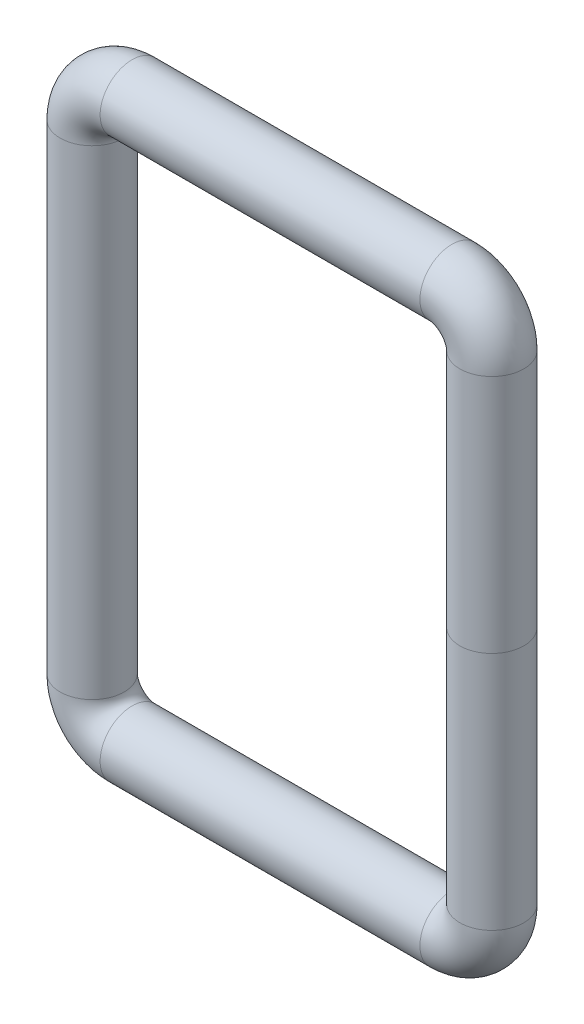
ISO-10303-21;
HEADER;
FILE_DESCRIPTION(('STEP AP214'),'2;1');
FILE_NAME('part.step','',(''),(''),'','','');
FILE_SCHEMA(('AUTOMOTIVE_DESIGN { 1 0 10303 214 1 1 1 1 }'));
ENDSEC;
DATA;
#1=APPLICATION_CONTEXT('core data for automotive mechanical design processes');
#2=APPLICATION_PROTOCOL_DEFINITION('international standard','automotive_design',2000,#1);
#3=PRODUCT_CONTEXT('',#1,'mechanical');
#4=PRODUCT('Part','Part','',(#3));
#5=PRODUCT_RELATED_PRODUCT_CATEGORY('part','',(#4));
#6=PRODUCT_DEFINITION_FORMATION('','',#4);
#7=PRODUCT_DEFINITION_CONTEXT('part definition',#1,'design');
#8=PRODUCT_DEFINITION('design','',#6,#7);
#9=PRODUCT_DEFINITION_SHAPE('','',#8);
#10=(LENGTH_UNIT() NAMED_UNIT(*) SI_UNIT(.MILLI.,.METRE.));
#11=(NAMED_UNIT(*) PLANE_ANGLE_UNIT() SI_UNIT($,.RADIAN.));
#12=(NAMED_UNIT(*) SI_UNIT($,.STERADIAN.) SOLID_ANGLE_UNIT());
#13=UNCERTAINTY_MEASURE_WITH_UNIT(LENGTH_MEASURE(1.E-05),#10,'distance_accuracy_value','');
#14=(GEOMETRIC_REPRESENTATION_CONTEXT(3) GLOBAL_UNCERTAINTY_ASSIGNED_CONTEXT((#13)) GLOBAL_UNIT_ASSIGNED_CONTEXT((#10,
#11,#12)) REPRESENTATION_CONTEXT('',''));
#15=CARTESIAN_POINT('',(0.,0.,0.));
#16=DIRECTION('',(0.,0.,1.));
#17=DIRECTION('',(1.,0.,0.));
#18=AXIS2_PLACEMENT_3D('',#15,#16,#17);
#19=CARTESIAN_POINT('',(2.5,0.,0.));
#20=DIRECTION('',(0.,-1.,0.));
#21=DIRECTION('',(0.,0.,-1.));
#22=AXIS2_PLACEMENT_3D('',#19,#20,#21);
#23=CYLINDRICAL_SURFACE('',#22,0.4);
#24=CARTESIAN_POINT('',(2.5,-3.,0.));
#25=DIRECTION('',(0.,1.,0.));
#26=DIRECTION('',(0.,0.,1.));
#27=AXIS2_PLACEMENT_3D('',#24,#25,#26);
#28=CIRCLE('',#27,0.4);
#29=CARTESIAN_POINT('',(2.9,-2.99999999999999,0.));
#30=VERTEX_POINT('',#29);
#31=EDGE_CURVE('E60',#30,#30,#28,.T.);
#32=ORIENTED_EDGE('',*,*,#31,.T.);
#33=EDGE_LOOP('',(#32));
#34=FACE_BOUND('',#33,.T.);
#35=CARTESIAN_POINT('',(2.5,0.,0.));
#36=DIRECTION('',(0.,1.,0.));
#37=DIRECTION('',(0.,0.,1.));
#38=AXIS2_PLACEMENT_3D('',#35,#36,#37);
#39=CIRCLE('',#38,0.4);
#40=CARTESIAN_POINT('',(2.5,0.,0.4));
#41=VERTEX_POINT('',#40);
#42=EDGE_CURVE('E63',#41,#41,#39,.T.);
#43=ORIENTED_EDGE('',*,*,#42,.F.);
#44=EDGE_LOOP('',(#43));
#45=FACE_BOUND('',#44,.T.);
#46=ADVANCED_FACE('F31',(#34,#45),#23,.T.);
#47=CARTESIAN_POINT('',(2.,-3.,0.));
#48=DIRECTION('',(0.,0.,-1.));
#49=DIRECTION('',(-1.,0.,0.));
#50=AXIS2_PLACEMENT_3D('',#47,#48,#49);
#51=TOROIDAL_SURFACE('',#50,0.5,0.4);
#52=CARTESIAN_POINT('',(2.,-3.5,0.));
#53=DIRECTION('',(1.,0.,0.));
#54=DIRECTION('',(0.,0.,1.));
#55=AXIS2_PLACEMENT_3D('',#52,#53,#54);
#56=CIRCLE('',#55,0.4);
#57=CARTESIAN_POINT('',(1.99999999999999,-3.9,0.));
#58=VERTEX_POINT('',#57);
#59=EDGE_CURVE('E57',#58,#58,#56,.T.);
#60=CARTESIAN_POINT('',(2.,-3.,0.));
#61=DIRECTION('',(0.,0.,-1.));
#62=DIRECTION('',(-1.,0.,0.));
#63=AXIS2_PLACEMENT_3D('',#60,#61,#62);
#64=CIRCLE('',#63,0.9);
#65=EDGE_CURVE('',#30,#58,#64,.T.);
#66=ORIENTED_EDGE('',*,*,#31,.F.);
#67=ORIENTED_EDGE('',*,*,#59,.T.);
#68=ORIENTED_EDGE('',*,*,#65,.T.);
#69=ORIENTED_EDGE('',*,*,#65,.F.);
#70=EDGE_LOOP('',(#66,#68,#67,#69));
#71=FACE_BOUND('',#70,.T.);
#72=ADVANCED_FACE('F70',(#71),#51,.T.);
#73=CARTESIAN_POINT('',(2.,-3.5,0.));
#74=DIRECTION('',(-1.,0.,0.));
#75=DIRECTION('',(0.,0.,1.));
#76=AXIS2_PLACEMENT_3D('',#73,#74,#75);
#77=CYLINDRICAL_SURFACE('',#76,0.4);
#78=CARTESIAN_POINT('',(-2.,-3.5,0.));
#79=DIRECTION('',(1.,0.,0.));
#80=DIRECTION('',(0.,0.,1.));
#81=AXIS2_PLACEMENT_3D('',#78,#79,#80);
#82=CIRCLE('',#81,0.4);
#83=CARTESIAN_POINT('',(-1.99999999999999,-3.9,0.));
#84=VERTEX_POINT('',#83);
#85=EDGE_CURVE('E54',#84,#84,#82,.T.);
#86=ORIENTED_EDGE('',*,*,#85,.T.);
#87=EDGE_LOOP('',(#86));
#88=FACE_BOUND('',#87,.T.);
#89=ORIENTED_EDGE('',*,*,#59,.F.);
#90=EDGE_LOOP('',(#89));
#91=FACE_BOUND('',#90,.T.);
#92=ADVANCED_FACE('F76',(#88,#91),#77,.T.);
#93=CARTESIAN_POINT('',(-2.,-3.,0.));
#94=DIRECTION('',(0.,0.,-1.));
#95=DIRECTION('',(-1.,0.,0.));
#96=AXIS2_PLACEMENT_3D('',#93,#94,#95);
#97=TOROIDAL_SURFACE('',#96,0.5,0.4);
#98=CARTESIAN_POINT('',(-2.5,-3.,0.));
#99=DIRECTION('',(0.,-1.,0.));
#100=DIRECTION('',(0.,0.,1.));
#101=AXIS2_PLACEMENT_3D('',#98,#99,#100);
#102=CIRCLE('',#101,0.4);
#103=CARTESIAN_POINT('',(-2.9,-2.99999999999999,0.));
#104=VERTEX_POINT('',#103);
#105=EDGE_CURVE('E51',#104,#104,#102,.T.);
#106=CARTESIAN_POINT('',(-2.,-3.,0.));
#107=DIRECTION('',(0.,0.,-1.));
#108=DIRECTION('',(-1.,0.,0.));
#109=AXIS2_PLACEMENT_3D('',#106,#107,#108);
#110=CIRCLE('',#109,0.9);
#111=EDGE_CURVE('',#84,#104,#110,.T.);
#112=ORIENTED_EDGE('',*,*,#85,.F.);
#113=ORIENTED_EDGE('',*,*,#105,.T.);
#114=ORIENTED_EDGE('',*,*,#111,.T.);
#115=ORIENTED_EDGE('',*,*,#111,.F.);
#116=EDGE_LOOP('',(#112,#114,#113,#115));
#117=FACE_BOUND('',#116,.T.);
#118=ADVANCED_FACE('F82',(#117),#97,.T.);
#119=CARTESIAN_POINT('',(-2.5,-3.,0.));
#120=DIRECTION('',(0.,1.,0.));
#121=DIRECTION('',(0.,0.,1.));
#122=AXIS2_PLACEMENT_3D('',#119,#120,#121);
#123=CYLINDRICAL_SURFACE('',#122,0.4);
#124=CARTESIAN_POINT('',(-2.5,3.,0.));
#125=DIRECTION('',(0.,-1.,0.));
#126=DIRECTION('',(0.,0.,1.));
#127=AXIS2_PLACEMENT_3D('',#124,#125,#126);
#128=CIRCLE('',#127,0.4);
#129=CARTESIAN_POINT('',(-2.9,3.,0.));
#130=VERTEX_POINT('',#129);
#131=EDGE_CURVE('E46',#130,#130,#128,.T.);
#132=ORIENTED_EDGE('',*,*,#131,.T.);
#133=EDGE_LOOP('',(#132));
#134=FACE_BOUND('',#133,.T.);
#135=ORIENTED_EDGE('',*,*,#105,.F.);
#136=EDGE_LOOP('',(#135));
#137=FACE_BOUND('',#136,.T.);
#138=ADVANCED_FACE('F86',(#134,#137),#123,.T.);
#139=CARTESIAN_POINT('',(-2.,3.,0.));
#140=DIRECTION('',(0.,0.,-1.));
#141=DIRECTION('',(-1.,0.,0.));
#142=AXIS2_PLACEMENT_3D('',#139,#140,#141);
#143=TOROIDAL_SURFACE('',#142,0.5,0.4);
#144=CARTESIAN_POINT('',(-2.,3.5,0.));
#145=DIRECTION('',(-1.,0.,0.));
#146=DIRECTION('',(0.,0.,1.));
#147=AXIS2_PLACEMENT_3D('',#144,#145,#146);
#148=CIRCLE('',#147,0.4);
#149=CARTESIAN_POINT('',(-1.99999999999999,3.9,0.));
#150=VERTEX_POINT('',#149);
#151=EDGE_CURVE('E42',#150,#150,#148,.T.);
#152=CARTESIAN_POINT('',(-2.,3.,0.));
#153=DIRECTION('',(0.,0.,-1.));
#154=DIRECTION('',(-1.,0.,0.));
#155=AXIS2_PLACEMENT_3D('',#152,#153,#154);
#156=CIRCLE('',#155,0.9);
#157=EDGE_CURVE('',#130,#150,#156,.T.);
#158=ORIENTED_EDGE('',*,*,#131,.F.);
#159=ORIENTED_EDGE('',*,*,#151,.T.);
#160=ORIENTED_EDGE('',*,*,#157,.T.);
#161=ORIENTED_EDGE('',*,*,#157,.F.);
#162=EDGE_LOOP('',(#158,#160,#159,#161));
#163=FACE_BOUND('',#162,.T.);
#164=ADVANCED_FACE('F90',(#163),#143,.T.);
#165=CARTESIAN_POINT('',(-2.,3.5,0.));
#166=DIRECTION('',(1.,0.,0.));
#167=DIRECTION('',(0.,0.,-1.));
#168=AXIS2_PLACEMENT_3D('',#165,#166,#167);
#169=CYLINDRICAL_SURFACE('',#168,0.4);
#170=CARTESIAN_POINT('',(2.,3.5,0.));
#171=DIRECTION('',(-1.,0.,0.));
#172=DIRECTION('',(0.,0.,1.));
#173=AXIS2_PLACEMENT_3D('',#170,#171,#172);
#174=CIRCLE('',#173,0.4);
#175=CARTESIAN_POINT('',(1.99999999999999,3.9,0.));
#176=VERTEX_POINT('',#175);
#177=EDGE_CURVE('E38',#176,#176,#174,.T.);
#178=ORIENTED_EDGE('',*,*,#177,.T.);
#179=EDGE_LOOP('',(#178));
#180=FACE_BOUND('',#179,.T.);
#181=ORIENTED_EDGE('',*,*,#151,.F.);
#182=EDGE_LOOP('',(#181));
#183=FACE_BOUND('',#182,.T.);
#184=ADVANCED_FACE('F94',(#180,#183),#169,.T.);
#185=CARTESIAN_POINT('',(2.,3.,0.));
#186=DIRECTION('',(0.,0.,-1.));
#187=DIRECTION('',(-1.,0.,0.));
#188=AXIS2_PLACEMENT_3D('',#185,#186,#187);
#189=TOROIDAL_SURFACE('',#188,0.5,0.4);
#190=CARTESIAN_POINT('',(2.5,3.,0.));
#191=DIRECTION('',(0.,1.,0.));
#192=DIRECTION('',(0.,0.,1.));
#193=AXIS2_PLACEMENT_3D('',#190,#191,#192);
#194=CIRCLE('',#193,0.4);
#195=CARTESIAN_POINT('',(2.9,3.,0.));
#196=VERTEX_POINT('',#195);
#197=EDGE_CURVE('E10',#196,#196,#194,.T.);
#198=CARTESIAN_POINT('',(2.,3.,0.));
#199=DIRECTION('',(0.,0.,-1.));
#200=DIRECTION('',(-1.,0.,0.));
#201=AXIS2_PLACEMENT_3D('',#198,#199,#200);
#202=CIRCLE('',#201,0.9);
#203=EDGE_CURVE('',#176,#196,#202,.T.);
#204=ORIENTED_EDGE('',*,*,#177,.F.);
#205=ORIENTED_EDGE('',*,*,#197,.T.);
#206=ORIENTED_EDGE('',*,*,#203,.T.);
#207=ORIENTED_EDGE('',*,*,#203,.F.);
#208=EDGE_LOOP('',(#204,#206,#205,#207));
#209=FACE_BOUND('',#208,.T.);
#210=ADVANCED_FACE('F97',(#209),#189,.T.);
#211=CARTESIAN_POINT('',(2.5,3.,0.));
#212=DIRECTION('',(0.,-1.,0.));
#213=DIRECTION('',(0.,0.,-1.));
#214=AXIS2_PLACEMENT_3D('',#211,#212,#213);
#215=CYLINDRICAL_SURFACE('',#214,0.4);
#216=ORIENTED_EDGE('',*,*,#42,.T.);
#217=EDGE_LOOP('',(#216));
#218=FACE_BOUND('',#217,.T.);
#219=ORIENTED_EDGE('',*,*,#197,.F.);
#220=EDGE_LOOP('',(#219));
#221=FACE_BOUND('',#220,.T.);
#222=ADVANCED_FACE('F33',(#218,#221),#215,.T.);
#223=CLOSED_SHELL('',(#46,#72,#92,#118,#138,#164,#184,#210,#222));
#224=MANIFOLD_SOLID_BREP('B2',#223);
#225=ADVANCED_BREP_SHAPE_REPRESENTATION('',(#18,#224),#14);
#226=SHAPE_DEFINITION_REPRESENTATION(#9,#225);
ENDSEC;
END-ISO-10303-21;
